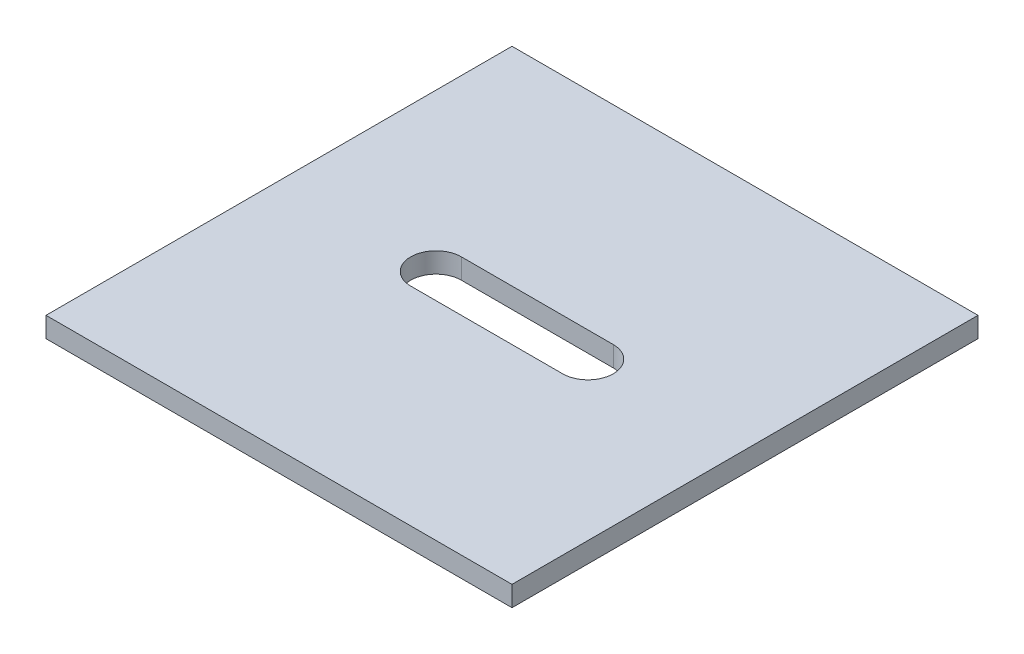
ISO-10303-21;
HEADER;
FILE_DESCRIPTION(('STEP AP214'),'2;1');
FILE_NAME('part.step','',(''),(''),'','','');
FILE_SCHEMA(('AUTOMOTIVE_DESIGN { 1 0 10303 214 1 1 1 1 }'));
ENDSEC;
DATA;
#1=APPLICATION_CONTEXT('core data for automotive mechanical design processes');
#2=APPLICATION_PROTOCOL_DEFINITION('international standard','automotive_design',2000,#1);
#3=PRODUCT_CONTEXT('',#1,'mechanical');
#4=PRODUCT('Part','Part','',(#3));
#5=PRODUCT_RELATED_PRODUCT_CATEGORY('part','',(#4));
#6=PRODUCT_DEFINITION_FORMATION('','',#4);
#7=PRODUCT_DEFINITION_CONTEXT('part definition',#1,'design');
#8=PRODUCT_DEFINITION('design','',#6,#7);
#9=PRODUCT_DEFINITION_SHAPE('','',#8);
#10=(LENGTH_UNIT() NAMED_UNIT(*) SI_UNIT(.MILLI.,.METRE.));
#11=(NAMED_UNIT(*) PLANE_ANGLE_UNIT() SI_UNIT($,.RADIAN.));
#12=(NAMED_UNIT(*) SI_UNIT($,.STERADIAN.) SOLID_ANGLE_UNIT());
#13=UNCERTAINTY_MEASURE_WITH_UNIT(LENGTH_MEASURE(1.E-05),#10,'distance_accuracy_value','');
#14=(GEOMETRIC_REPRESENTATION_CONTEXT(3) GLOBAL_UNCERTAINTY_ASSIGNED_CONTEXT((#13)) GLOBAL_UNIT_ASSIGNED_CONTEXT((#10,
#11,#12)) REPRESENTATION_CONTEXT('',''));
#15=CARTESIAN_POINT('',(0.,0.,0.));
#16=DIRECTION('',(0.,0.,1.));
#17=DIRECTION('',(1.,0.,0.));
#18=AXIS2_PLACEMENT_3D('',#15,#16,#17);
#19=CARTESIAN_POINT('',(0.,12.,0.));
#20=DIRECTION('',(0.,-1.,0.));
#21=DIRECTION('',(0.,0.,-1.));
#22=AXIS2_PLACEMENT_3D('',#19,#20,#21);
#23=PLANE('',#22);
#24=DIRECTION('',(0.,0.,-1.));
#25=VECTOR('',#24,1.);
#26=CARTESIAN_POINT('',(0.,12.,0.));
#27=LINE('',#26,#25);
#28=CARTESIAN_POINT('',(0.,12.,0.));
#29=VERTEX_POINT('',#28);
#30=CARTESIAN_POINT('',(0.,12.,-276.));
#31=VERTEX_POINT('',#30);
#32=EDGE_CURVE('E128',#29,#31,#27,.T.);
#33=ORIENTED_EDGE('',*,*,#32,.F.);
#34=DIRECTION('',(1.,0.,0.));
#35=VECTOR('',#34,1.);
#36=CARTESIAN_POINT('',(0.,12.,0.));
#37=LINE('',#36,#35);
#38=CARTESIAN_POINT('',(276.,12.,0.));
#39=VERTEX_POINT('',#38);
#40=EDGE_CURVE('E137',#29,#39,#37,.T.);
#41=ORIENTED_EDGE('',*,*,#40,.T.);
#42=DIRECTION('',(0.,0.,-1.));
#43=VECTOR('',#42,1.);
#44=CARTESIAN_POINT('',(276.,12.,0.));
#45=LINE('',#44,#43);
#46=CARTESIAN_POINT('',(276.,12.,-276.));
#47=VERTEX_POINT('',#46);
#48=EDGE_CURVE('E135',#39,#47,#45,.T.);
#49=ORIENTED_EDGE('',*,*,#48,.T.);
#50=DIRECTION('',(1.,0.,0.));
#51=VECTOR('',#50,1.);
#52=CARTESIAN_POINT('',(0.,12.,-276.));
#53=LINE('',#52,#51);
#54=EDGE_CURVE('E131',#31,#47,#53,.T.);
#55=ORIENTED_EDGE('',*,*,#54,.F.);
#56=EDGE_LOOP('',(#33,#41,#49,#55));
#57=FACE_BOUND('',#56,.T.);
#58=CARTESIAN_POINT('',(183.,12.,-138.));
#59=DIRECTION('',(0.,-1.,0.));
#60=DIRECTION('',(0.,0.,-1.));
#61=AXIS2_PLACEMENT_3D('',#58,#59,#60);
#62=CIRCLE('',#61,15.);
#63=CARTESIAN_POINT('',(183.,12.,-153.));
#64=VERTEX_POINT('',#63);
#65=CARTESIAN_POINT('',(183.,12.,-123.));
#66=VERTEX_POINT('',#65);
#67=EDGE_CURVE('E104',#64,#66,#62,.T.);
#68=ORIENTED_EDGE('',*,*,#67,.T.);
#69=DIRECTION('',(-1.,0.,0.));
#70=VECTOR('',#69,1.);
#71=CARTESIAN_POINT('',(93.,12.,-123.));
#72=LINE('',#71,#70);
#73=CARTESIAN_POINT('',(93.,12.,-123.));
#74=VERTEX_POINT('',#73);
#75=EDGE_CURVE('E127',#66,#74,#72,.T.);
#76=ORIENTED_EDGE('',*,*,#75,.T.);
#77=CARTESIAN_POINT('',(93.,12.,-138.));
#78=DIRECTION('',(0.,-1.,0.));
#79=DIRECTION('',(0.,0.,-1.));
#80=AXIS2_PLACEMENT_3D('',#77,#78,#79);
#81=CIRCLE('',#80,15.);
#82=CARTESIAN_POINT('',(93.,12.,-153.));
#83=VERTEX_POINT('',#82);
#84=EDGE_CURVE('E176',#74,#83,#81,.T.);
#85=ORIENTED_EDGE('',*,*,#84,.T.);
#86=DIRECTION('',(-1.,0.,0.));
#87=VECTOR('',#86,1.);
#88=CARTESIAN_POINT('',(93.,12.,-153.));
#89=LINE('',#88,#87);
#90=EDGE_CURVE('E143',#64,#83,#89,.T.);
#91=ORIENTED_EDGE('',*,*,#90,.F.);
#92=EDGE_LOOP('',(#68,#76,#85,#91));
#93=FACE_BOUND('',#92,.T.);
#94=ADVANCED_FACE('F32',(#57,#93),#23,.F.);
#95=CARTESIAN_POINT('',(0.,0.,0.));
#96=DIRECTION('',(0.,-1.,0.));
#97=DIRECTION('',(0.,0.,-1.));
#98=AXIS2_PLACEMENT_3D('',#95,#96,#97);
#99=PLANE('',#98);
#100=DIRECTION('',(0.,0.,-1.));
#101=VECTOR('',#100,1.);
#102=CARTESIAN_POINT('',(0.,0.,0.));
#103=LINE('',#102,#101);
#104=CARTESIAN_POINT('',(0.,0.,0.));
#105=VERTEX_POINT('',#104);
#106=CARTESIAN_POINT('',(0.,0.,-276.));
#107=VERTEX_POINT('',#106);
#108=EDGE_CURVE('E139',#105,#107,#103,.T.);
#109=ORIENTED_EDGE('',*,*,#108,.T.);
#110=DIRECTION('',(1.,0.,0.));
#111=VECTOR('',#110,1.);
#112=CARTESIAN_POINT('',(0.,0.,-276.));
#113=LINE('',#112,#111);
#114=CARTESIAN_POINT('',(276.,0.,-276.));
#115=VERTEX_POINT('',#114);
#116=EDGE_CURVE('E142',#107,#115,#113,.T.);
#117=ORIENTED_EDGE('',*,*,#116,.T.);
#118=DIRECTION('',(0.,0.,-1.));
#119=VECTOR('',#118,1.);
#120=CARTESIAN_POINT('',(276.,0.,0.));
#121=LINE('',#120,#119);
#122=CARTESIAN_POINT('',(276.,0.,0.));
#123=VERTEX_POINT('',#122);
#124=EDGE_CURVE('E146',#123,#115,#121,.T.);
#125=ORIENTED_EDGE('',*,*,#124,.F.);
#126=DIRECTION('',(1.,0.,0.));
#127=VECTOR('',#126,1.);
#128=CARTESIAN_POINT('',(0.,0.,0.));
#129=LINE('',#128,#127);
#130=EDGE_CURVE('E132',#105,#123,#129,.T.);
#131=ORIENTED_EDGE('',*,*,#130,.F.);
#132=EDGE_LOOP('',(#109,#117,#125,#131));
#133=FACE_BOUND('',#132,.T.);
#134=DIRECTION('',(1.,0.,0.));
#135=VECTOR('',#134,1.);
#136=CARTESIAN_POINT('',(93.,0.,-123.));
#137=LINE('',#136,#135);
#138=CARTESIAN_POINT('',(93.,0.,-123.));
#139=VERTEX_POINT('',#138);
#140=CARTESIAN_POINT('',(183.,0.,-123.));
#141=VERTEX_POINT('',#140);
#142=EDGE_CURVE('E116',#139,#141,#137,.T.);
#143=ORIENTED_EDGE('',*,*,#142,.T.);
#144=CARTESIAN_POINT('',(183.,0.,-138.));
#145=DIRECTION('',(0.,1.,0.));
#146=DIRECTION('',(0.,0.,1.));
#147=AXIS2_PLACEMENT_3D('',#144,#145,#146);
#148=CIRCLE('',#147,15.);
#149=CARTESIAN_POINT('',(183.,0.,-153.));
#150=VERTEX_POINT('',#149);
#151=EDGE_CURVE('E101',#141,#150,#148,.T.);
#152=ORIENTED_EDGE('',*,*,#151,.T.);
#153=DIRECTION('',(1.,0.,0.));
#154=VECTOR('',#153,1.);
#155=CARTESIAN_POINT('',(93.,0.,-153.));
#156=LINE('',#155,#154);
#157=CARTESIAN_POINT('',(93.,0.,-153.));
#158=VERTEX_POINT('',#157);
#159=EDGE_CURVE('E109',#158,#150,#156,.T.);
#160=ORIENTED_EDGE('',*,*,#159,.F.);
#161=CARTESIAN_POINT('',(93.,0.,-138.));
#162=DIRECTION('',(0.,1.,0.));
#163=DIRECTION('',(0.,0.,1.));
#164=AXIS2_PLACEMENT_3D('',#161,#162,#163);
#165=CIRCLE('',#164,15.);
#166=EDGE_CURVE('E57',#158,#139,#165,.T.);
#167=ORIENTED_EDGE('',*,*,#166,.T.);
#168=EDGE_LOOP('',(#143,#152,#160,#167));
#169=FACE_BOUND('',#168,.T.);
#170=ADVANCED_FACE('F114',(#133,#169),#99,.T.);
#171=CARTESIAN_POINT('',(0.,12.,0.));
#172=DIRECTION('',(-1.,0.,0.));
#173=DIRECTION('',(0.,0.,1.));
#174=AXIS2_PLACEMENT_3D('',#171,#172,#173);
#175=PLANE('',#174);
#176=ORIENTED_EDGE('',*,*,#108,.F.);
#177=DIRECTION('',(0.,-1.,0.));
#178=VECTOR('',#177,1.);
#179=CARTESIAN_POINT('',(0.,12.,0.));
#180=LINE('',#179,#178);
#181=EDGE_CURVE('E11',#29,#105,#180,.T.);
#182=ORIENTED_EDGE('',*,*,#181,.F.);
#183=ORIENTED_EDGE('',*,*,#32,.T.);
#184=DIRECTION('',(0.,-1.,0.));
#185=VECTOR('',#184,1.);
#186=CARTESIAN_POINT('',(0.,12.,-276.));
#187=LINE('',#186,#185);
#188=EDGE_CURVE('E36',#31,#107,#187,.T.);
#189=ORIENTED_EDGE('',*,*,#188,.T.);
#190=EDGE_LOOP('',(#176,#182,#183,#189));
#191=FACE_BOUND('',#190,.T.);
#192=ADVANCED_FACE('F34',(#191),#175,.T.);
#193=CARTESIAN_POINT('',(0.,12.,0.));
#194=DIRECTION('',(0.,0.,-1.));
#195=DIRECTION('',(-1.,0.,0.));
#196=AXIS2_PLACEMENT_3D('',#193,#194,#195);
#197=PLANE('',#196);
#198=ORIENTED_EDGE('',*,*,#130,.T.);
#199=DIRECTION('',(0.,-1.,0.));
#200=VECTOR('',#199,1.);
#201=CARTESIAN_POINT('',(276.,12.,0.));
#202=LINE('',#201,#200);
#203=EDGE_CURVE('E41',#39,#123,#202,.T.);
#204=ORIENTED_EDGE('',*,*,#203,.F.);
#205=ORIENTED_EDGE('',*,*,#40,.F.);
#206=ORIENTED_EDGE('',*,*,#181,.T.);
#207=EDGE_LOOP('',(#198,#204,#205,#206));
#208=FACE_BOUND('',#207,.T.);
#209=ADVANCED_FACE('F165',(#208),#197,.F.);
#210=CARTESIAN_POINT('',(276.,12.,0.));
#211=DIRECTION('',(-1.,0.,0.));
#212=DIRECTION('',(0.,0.,1.));
#213=AXIS2_PLACEMENT_3D('',#210,#211,#212);
#214=PLANE('',#213);
#215=ORIENTED_EDGE('',*,*,#124,.T.);
#216=DIRECTION('',(0.,-1.,0.));
#217=VECTOR('',#216,1.);
#218=CARTESIAN_POINT('',(276.,12.,-276.));
#219=LINE('',#218,#217);
#220=EDGE_CURVE('E151',#47,#115,#219,.T.);
#221=ORIENTED_EDGE('',*,*,#220,.F.);
#222=ORIENTED_EDGE('',*,*,#48,.F.);
#223=ORIENTED_EDGE('',*,*,#203,.T.);
#224=EDGE_LOOP('',(#215,#221,#222,#223));
#225=FACE_BOUND('',#224,.T.);
#226=ADVANCED_FACE('F169',(#225),#214,.F.);
#227=CARTESIAN_POINT('',(0.,12.,-276.));
#228=DIRECTION('',(0.,0.,-1.));
#229=DIRECTION('',(-1.,0.,0.));
#230=AXIS2_PLACEMENT_3D('',#227,#228,#229);
#231=PLANE('',#230);
#232=ORIENTED_EDGE('',*,*,#116,.F.);
#233=ORIENTED_EDGE('',*,*,#188,.F.);
#234=ORIENTED_EDGE('',*,*,#54,.T.);
#235=ORIENTED_EDGE('',*,*,#220,.T.);
#236=EDGE_LOOP('',(#232,#233,#234,#235));
#237=FACE_BOUND('',#236,.T.);
#238=ADVANCED_FACE('F159',(#237),#231,.T.);
#239=CARTESIAN_POINT('',(183.,135.69316876853,-138.));
#240=DIRECTION('',(0.,-1.,0.));
#241=DIRECTION('',(0.,0.,-1.));
#242=AXIS2_PLACEMENT_3D('',#239,#240,#241);
#243=CYLINDRICAL_SURFACE('',#242,15.);
#244=DIRECTION('',(0.,-1.,0.));
#245=VECTOR('',#244,1.);
#246=CARTESIAN_POINT('',(183.,135.69316876853,-153.));
#247=LINE('',#246,#245);
#248=EDGE_CURVE('E49',#64,#150,#247,.T.);
#249=ORIENTED_EDGE('',*,*,#248,.T.);
#250=ORIENTED_EDGE('',*,*,#151,.F.);
#251=DIRECTION('',(0.,-1.,0.));
#252=VECTOR('',#251,1.);
#253=CARTESIAN_POINT('',(183.,135.69316876853,-123.));
#254=LINE('',#253,#252);
#255=EDGE_CURVE('E106',#66,#141,#254,.T.);
#256=ORIENTED_EDGE('',*,*,#255,.F.);
#257=ORIENTED_EDGE('',*,*,#67,.F.);
#258=EDGE_LOOP('',(#249,#250,#256,#257));
#259=FACE_BOUND('',#258,.T.);
#260=ADVANCED_FACE('F98',(#259),#243,.F.);
#261=CARTESIAN_POINT('',(93.,135.69316876853,-123.));
#262=DIRECTION('',(0.,0.,-1.));
#263=DIRECTION('',(-1.,0.,0.));
#264=AXIS2_PLACEMENT_3D('',#261,#262,#263);
#265=PLANE('',#264);
#266=ORIENTED_EDGE('',*,*,#255,.T.);
#267=ORIENTED_EDGE('',*,*,#142,.F.);
#268=DIRECTION('',(0.,-1.,0.));
#269=VECTOR('',#268,1.);
#270=CARTESIAN_POINT('',(93.,135.69316876853,-123.));
#271=LINE('',#270,#269);
#272=EDGE_CURVE('E123',#74,#139,#271,.T.);
#273=ORIENTED_EDGE('',*,*,#272,.F.);
#274=ORIENTED_EDGE('',*,*,#75,.F.);
#275=EDGE_LOOP('',(#266,#267,#273,#274));
#276=FACE_BOUND('',#275,.T.);
#277=ADVANCED_FACE('F182',(#276),#265,.T.);
#278=CARTESIAN_POINT('',(93.,135.69316876853,-138.));
#279=DIRECTION('',(0.,-1.,0.));
#280=DIRECTION('',(0.,0.,-1.));
#281=AXIS2_PLACEMENT_3D('',#278,#279,#280);
#282=CYLINDRICAL_SURFACE('',#281,15.);
#283=ORIENTED_EDGE('',*,*,#272,.T.);
#284=ORIENTED_EDGE('',*,*,#166,.F.);
#285=DIRECTION('',(0.,-1.,0.));
#286=VECTOR('',#285,1.);
#287=CARTESIAN_POINT('',(93.,135.69316876853,-153.));
#288=LINE('',#287,#286);
#289=EDGE_CURVE('E111',#83,#158,#288,.T.);
#290=ORIENTED_EDGE('',*,*,#289,.F.);
#291=ORIENTED_EDGE('',*,*,#84,.F.);
#292=EDGE_LOOP('',(#283,#284,#290,#291));
#293=FACE_BOUND('',#292,.T.);
#294=ADVANCED_FACE('F179',(#293),#282,.F.);
#295=CARTESIAN_POINT('',(93.,135.69316876853,-153.));
#296=DIRECTION('',(0.,0.,-1.));
#297=DIRECTION('',(-1.,0.,0.));
#298=AXIS2_PLACEMENT_3D('',#295,#296,#297);
#299=PLANE('',#298);
#300=ORIENTED_EDGE('',*,*,#90,.T.);
#301=ORIENTED_EDGE('',*,*,#289,.T.);
#302=ORIENTED_EDGE('',*,*,#159,.T.);
#303=ORIENTED_EDGE('',*,*,#248,.F.);
#304=EDGE_LOOP('',(#300,#301,#302,#303));
#305=FACE_BOUND('',#304,.T.);
#306=ADVANCED_FACE('F110',(#305),#299,.F.);
#307=CLOSED_SHELL('',(#94,#170,#192,#209,#226,#238,#260,#277,#294,#306));
#308=MANIFOLD_SOLID_BREP('B2',#307);
#309=ADVANCED_BREP_SHAPE_REPRESENTATION('',(#18,#308),#14);
#310=SHAPE_DEFINITION_REPRESENTATION(#9,#309);
ENDSEC;
END-ISO-10303-21;
